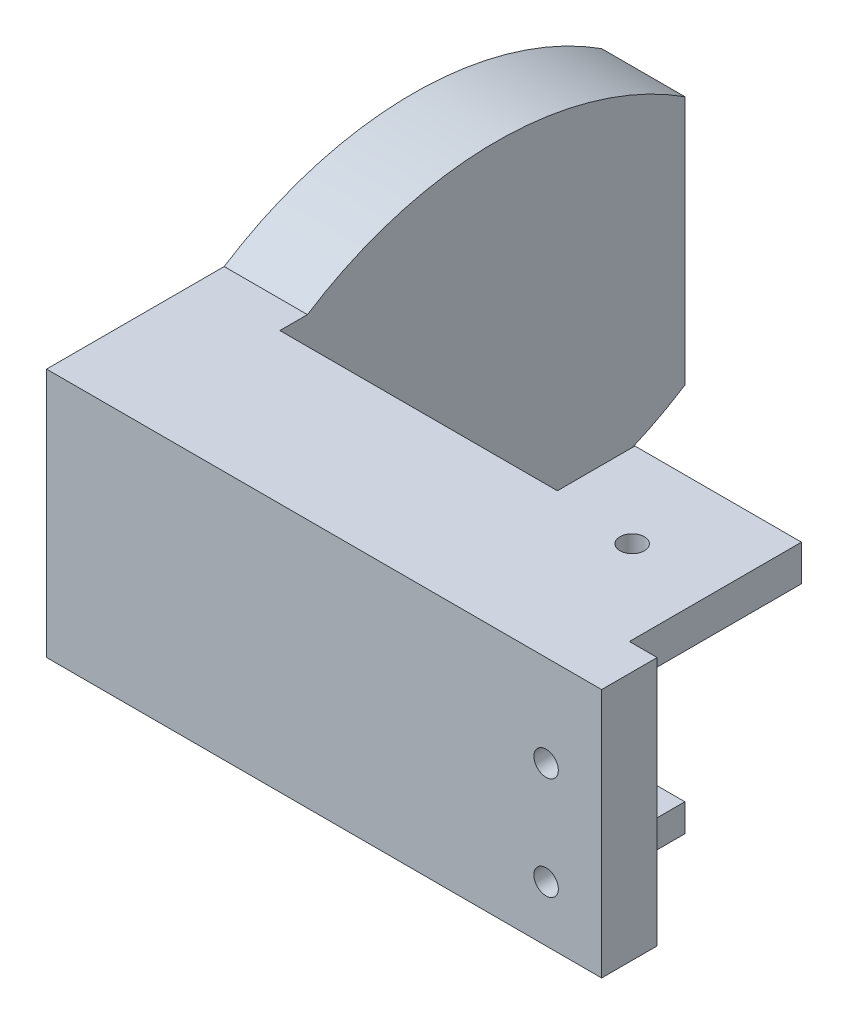
ISO-10303-21;
HEADER;
FILE_DESCRIPTION(('STEP AP214'),'2;1');
FILE_NAME('part.step','',(''),(''),'','','');
FILE_SCHEMA(('AUTOMOTIVE_DESIGN { 1 0 10303 214 1 1 1 1 }'));
ENDSEC;
DATA;
#1=APPLICATION_CONTEXT('core data for automotive mechanical design processes');
#2=APPLICATION_PROTOCOL_DEFINITION('international standard','automotive_design',2000,#1);
#3=PRODUCT_CONTEXT('',#1,'mechanical');
#4=PRODUCT('Part','Part','',(#3));
#5=PRODUCT_RELATED_PRODUCT_CATEGORY('part','',(#4));
#6=PRODUCT_DEFINITION_FORMATION('','',#4);
#7=PRODUCT_DEFINITION_CONTEXT('part definition',#1,'design');
#8=PRODUCT_DEFINITION('design','',#6,#7);
#9=PRODUCT_DEFINITION_SHAPE('','',#8);
#10=(LENGTH_UNIT() NAMED_UNIT(*) SI_UNIT(.MILLI.,.METRE.));
#11=(NAMED_UNIT(*) PLANE_ANGLE_UNIT() SI_UNIT($,.RADIAN.));
#12=(NAMED_UNIT(*) SI_UNIT($,.STERADIAN.) SOLID_ANGLE_UNIT());
#13=UNCERTAINTY_MEASURE_WITH_UNIT(LENGTH_MEASURE(1.E-05),#10,'distance_accuracy_value','');
#14=(GEOMETRIC_REPRESENTATION_CONTEXT(3) GLOBAL_UNCERTAINTY_ASSIGNED_CONTEXT((#13)) GLOBAL_UNIT_ASSIGNED_CONTEXT((#10,
#11,#12)) REPRESENTATION_CONTEXT('',''));
#15=CARTESIAN_POINT('',(0.,0.,0.));
#16=DIRECTION('',(0.,0.,1.));
#17=DIRECTION('',(1.,0.,0.));
#18=AXIS2_PLACEMENT_3D('',#15,#16,#17);
#19=CARTESIAN_POINT('',(-152.4,0.,0.));
#20=DIRECTION('',(1.,0.,0.));
#21=DIRECTION('',(0.,0.,1.));
#22=AXIS2_PLACEMENT_3D('',#19,#20,#21);
#23=PLANE('',#22);
#24=CARTESIAN_POINT('',(-152.4,25.4,0.));
#25=DIRECTION('',(-1.,0.,0.));
#26=DIRECTION('',(0.,0.,1.));
#27=AXIS2_PLACEMENT_3D('',#24,#25,#26);
#28=CIRCLE('',#27,28.575);
#29=CARTESIAN_POINT('',(-152.4,14.2875,26.325709273446));
#30=VERTEX_POINT('',#29);
#31=CARTESIAN_POINT('',(-152.4,35.5600000000367,26.7077708728986));
#32=VERTEX_POINT('',#31);
#33=EDGE_CURVE('E261',#30,#32,#28,.T.);
#34=ORIENTED_EDGE('',*,*,#33,.T.);
#35=DIRECTION('',(0.,0.,-1.));
#36=VECTOR('',#35,1.);
#37=CARTESIAN_POINT('',(-152.4,35.5600000000367,15.875));
#38=LINE('',#37,#36);
#39=CARTESIAN_POINT('',(-152.4,35.5600000000367,35.56));
#40=VERTEX_POINT('',#39);
#41=EDGE_CURVE('E231',#40,#32,#38,.T.);
#42=ORIENTED_EDGE('',*,*,#41,.F.);
#43=DIRECTION('',(0.,-1.,0.));
#44=VECTOR('',#43,1.);
#45=CARTESIAN_POINT('',(-152.4,39.6875,35.56));
#46=LINE('',#45,#44);
#47=CARTESIAN_POINT('',(-152.4,14.2875,35.56));
#48=VERTEX_POINT('',#47);
#49=EDGE_CURVE('E262',#40,#48,#46,.T.);
#50=ORIENTED_EDGE('',*,*,#49,.T.);
#51=DIRECTION('',(0.,0.,1.));
#52=VECTOR('',#51,1.);
#53=CARTESIAN_POINT('',(-152.4,14.2875,35.56));
#54=LINE('',#53,#52);
#55=EDGE_CURVE('E165',#30,#48,#54,.T.);
#56=ORIENTED_EDGE('',*,*,#55,.F.);
#57=EDGE_LOOP('',(#34,#42,#50,#56));
#58=FACE_BOUND('',#57,.T.);
#59=ADVANCED_FACE('F37',(#58),#23,.T.);
#60=CARTESIAN_POINT('',(-130.175,11.1125,35.56));
#61=DIRECTION('',(0.,0.,-1.));
#62=DIRECTION('',(1.,0.,0.));
#63=AXIS2_PLACEMENT_3D('',#60,#61,#62);
#64=PLANE('',#63);
#65=CARTESIAN_POINT('',(-136.525,17.4625,35.56));
#66=DIRECTION('',(0.,0.,1.));
#67=DIRECTION('',(1.,0.,0.));
#68=AXIS2_PLACEMENT_3D('',#65,#66,#67);
#69=CIRCLE('',#68,1.39699999999828);
#70=CARTESIAN_POINT('',(-135.128000000002,17.4625,35.56));
#71=VERTEX_POINT('',#70);
#72=EDGE_CURVE('E198',#71,#71,#69,.T.);
#73=ORIENTED_EDGE('',*,*,#72,.T.);
#74=EDGE_LOOP('',(#73));
#75=FACE_BOUND('',#74,.T.);
#76=CARTESIAN_POINT('',(-136.525,29.2100000000367,35.56));
#77=DIRECTION('',(0.,0.,1.));
#78=DIRECTION('',(1.,0.,0.));
#79=AXIS2_PLACEMENT_3D('',#76,#77,#78);
#80=CIRCLE('',#79,1.39699999999828);
#81=CARTESIAN_POINT('',(-135.128000000002,29.2100000000367,35.56));
#82=VERTEX_POINT('',#81);
#83=EDGE_CURVE('E193',#82,#82,#80,.T.);
#84=ORIENTED_EDGE('',*,*,#83,.T.);
#85=EDGE_LOOP('',(#84));
#86=FACE_BOUND('',#85,.T.);
#87=ORIENTED_EDGE('',*,*,#49,.F.);
#88=DIRECTION('',(-1.,0.,0.));
#89=VECTOR('',#88,1.);
#90=CARTESIAN_POINT('',(-133.35,35.5600000000367,35.56));
#91=LINE('',#90,#89);
#92=CARTESIAN_POINT('',(-133.35,35.5600000000367,35.56));
#93=VERTEX_POINT('',#92);
#94=EDGE_CURVE('E235',#93,#40,#91,.T.);
#95=ORIENTED_EDGE('',*,*,#94,.F.);
#96=DIRECTION('',(0.,-1.,0.));
#97=VECTOR('',#96,1.);
#98=CARTESIAN_POINT('',(-133.35,67.0809613548562,35.56));
#99=LINE('',#98,#97);
#100=CARTESIAN_POINT('',(-133.35,39.6875,35.56));
#101=VERTEX_POINT('',#100);
#102=EDGE_CURVE('E238',#101,#93,#99,.T.);
#103=ORIENTED_EDGE('',*,*,#102,.F.);
#104=DIRECTION('',(-1.,0.,0.));
#105=VECTOR('',#104,1.);
#106=CARTESIAN_POINT('',(-130.175,39.6875,35.56));
#107=LINE('',#106,#105);
#108=CARTESIAN_POINT('',(-130.175,39.6875,35.56));
#109=VERTEX_POINT('',#108);
#110=EDGE_CURVE('E212',#109,#101,#107,.T.);
#111=ORIENTED_EDGE('',*,*,#110,.F.);
#112=DIRECTION('',(0.,1.,0.));
#113=VECTOR('',#112,1.);
#114=CARTESIAN_POINT('',(-130.175,11.1125,35.56));
#115=LINE('',#114,#113);
#116=CARTESIAN_POINT('',(-130.175,11.1125,35.56));
#117=VERTEX_POINT('',#116);
#118=EDGE_CURVE('E202',#117,#109,#115,.T.);
#119=ORIENTED_EDGE('',*,*,#118,.F.);
#120=DIRECTION('',(-1.,0.,0.));
#121=VECTOR('',#120,1.);
#122=CARTESIAN_POINT('',(-130.175,11.1125,35.56));
#123=LINE('',#122,#121);
#124=CARTESIAN_POINT('',(-139.7,11.1125,35.56));
#125=VERTEX_POINT('',#124);
#126=EDGE_CURVE('E214',#117,#125,#123,.T.);
#127=ORIENTED_EDGE('',*,*,#126,.T.);
#128=DIRECTION('',(0.,1.,0.));
#129=VECTOR('',#128,1.);
#130=CARTESIAN_POINT('',(-139.7,-6.84801224213828,35.56));
#131=LINE('',#130,#129);
#132=CARTESIAN_POINT('',(-139.7,14.2875,35.56));
#133=VERTEX_POINT('',#132);
#134=EDGE_CURVE('E352',#125,#133,#131,.T.);
#135=ORIENTED_EDGE('',*,*,#134,.T.);
#136=DIRECTION('',(1.,0.,0.));
#137=VECTOR('',#136,1.);
#138=CARTESIAN_POINT('',(-139.7,14.2875,35.56));
#139=LINE('',#138,#137);
#140=EDGE_CURVE('E189',#48,#133,#139,.T.);
#141=ORIENTED_EDGE('',*,*,#140,.F.);
#142=EDGE_LOOP('',(#87,#95,#103,#111,#119,#127,#135,#141));
#143=FACE_BOUND('',#142,.T.);
#144=ADVANCED_FACE('F331',(#75,#86,#143),#64,.T.);
#145=CARTESIAN_POINT('',(-193.675,6.15950000000119,-3.10155059200292E-13));
#146=DIRECTION('',(1.,0.,0.));
#147=DIRECTION('',(0.,0.,1.));
#148=AXIS2_PLACEMENT_3D('',#145,#146,#147);
#149=CYLINDRICAL_SURFACE('',#148,39.8779999999988);
#150=CARTESIAN_POINT('',(-184.15,6.15950000000119,-3.10155059200292E-13));
#151=DIRECTION('',(1.,0.,0.));
#152=DIRECTION('',(0.,0.,1.));
#153=AXIS2_PLACEMENT_3D('',#150,#151,#152);
#154=CIRCLE('',#153,39.8779999999988);
#155=CARTESIAN_POINT('',(-184.15,39.6875,-21.59));
#156=VERTEX_POINT('',#155);
#157=CARTESIAN_POINT('',(-184.15,39.6875,21.5899999999993));
#158=VERTEX_POINT('',#157);
#159=EDGE_CURVE('E268',#156,#158,#154,.T.);
#160=ORIENTED_EDGE('',*,*,#159,.F.);
#161=DIRECTION('',(1.,0.,0.));
#162=VECTOR('',#161,1.);
#163=CARTESIAN_POINT('',(-193.675,39.6875,-21.59));
#164=LINE('',#163,#162);
#165=CARTESIAN_POINT('',(-193.675,39.6875,-21.59));
#166=VERTEX_POINT('',#165);
#167=EDGE_CURVE('E284',#166,#156,#164,.T.);
#168=ORIENTED_EDGE('',*,*,#167,.F.);
#169=CARTESIAN_POINT('',(-193.675,6.15950000000119,-3.10155059200292E-13));
#170=DIRECTION('',(1.,0.,0.));
#171=DIRECTION('',(0.,0.,1.));
#172=AXIS2_PLACEMENT_3D('',#169,#170,#171);
#173=CIRCLE('',#172,39.8779999999988);
#174=CARTESIAN_POINT('',(-193.675,39.6875,21.5899999999993));
#175=VERTEX_POINT('',#174);
#176=EDGE_CURVE('E269',#166,#175,#173,.T.);
#177=ORIENTED_EDGE('',*,*,#176,.T.);
#178=DIRECTION('',(1.,0.,0.));
#179=VECTOR('',#178,1.);
#180=CARTESIAN_POINT('',(-193.675,39.6875,21.5899999999993));
#181=LINE('',#180,#179);
#182=EDGE_CURVE('E45',#175,#158,#181,.T.);
#183=ORIENTED_EDGE('',*,*,#182,.T.);
#184=EDGE_LOOP('',(#160,#168,#177,#183));
#185=FACE_BOUND('',#184,.T.);
#186=ADVANCED_FACE('F39',(#185),#149,.T.);
#187=CARTESIAN_POINT('',(-193.675,39.6875,35.56));
#188=DIRECTION('',(0.,-1.,0.));
#189=DIRECTION('',(0.,0.,-1.));
#190=AXIS2_PLACEMENT_3D('',#187,#188,#189);
#191=PLANE('',#190);
#192=DIRECTION('',(0.,0.,1.));
#193=VECTOR('',#192,1.);
#194=CARTESIAN_POINT('',(-184.15,39.6875,35.56));
#195=LINE('',#194,#193);
#196=CARTESIAN_POINT('',(-184.15,39.6875,24.7466759131403));
#197=VERTEX_POINT('',#196);
#198=EDGE_CURVE('E287',#158,#197,#195,.T.);
#199=ORIENTED_EDGE('',*,*,#198,.F.);
#200=ORIENTED_EDGE('',*,*,#182,.F.);
#201=DIRECTION('',(0.,0.,1.));
#202=VECTOR('',#201,1.);
#203=CARTESIAN_POINT('',(-193.675,39.6875,35.56));
#204=LINE('',#203,#202);
#205=CARTESIAN_POINT('',(-193.675,39.6875,41.91));
#206=VERTEX_POINT('',#205);
#207=EDGE_CURVE('E272',#175,#206,#204,.T.);
#208=ORIENTED_EDGE('',*,*,#207,.T.);
#209=DIRECTION('',(-1.,0.,0.));
#210=VECTOR('',#209,1.);
#211=CARTESIAN_POINT('',(-130.175,39.6875,41.91));
#212=LINE('',#211,#210);
#213=CARTESIAN_POINT('',(-130.175,39.6875,41.91));
#214=VERTEX_POINT('',#213);
#215=EDGE_CURVE('E221',#214,#206,#212,.T.);
#216=ORIENTED_EDGE('',*,*,#215,.F.);
#217=DIRECTION('',(0.,0.,1.));
#218=VECTOR('',#217,1.);
#219=CARTESIAN_POINT('',(-130.175,39.6875,35.56));
#220=LINE('',#219,#218);
#221=EDGE_CURVE('E205',#109,#214,#220,.T.);
#222=ORIENTED_EDGE('',*,*,#221,.F.);
#223=ORIENTED_EDGE('',*,*,#110,.T.);
#224=DIRECTION('',(0.,0.,-1.));
#225=VECTOR('',#224,1.);
#226=CARTESIAN_POINT('',(-133.35,39.6875,15.875));
#227=LINE('',#226,#225);
#228=CARTESIAN_POINT('',(-133.35,39.6875,15.875));
#229=VERTEX_POINT('',#228);
#230=EDGE_CURVE('E244',#101,#229,#227,.T.);
#231=ORIENTED_EDGE('',*,*,#230,.T.);
#232=DIRECTION('',(-1.,0.,0.));
#233=VECTOR('',#232,1.);
#234=CARTESIAN_POINT('',(-133.35,39.6875,15.875));
#235=LINE('',#234,#233);
#236=CARTESIAN_POINT('',(-152.4,39.6875,15.875));
#237=VERTEX_POINT('',#236);
#238=EDGE_CURVE('E234',#229,#237,#235,.T.);
#239=ORIENTED_EDGE('',*,*,#238,.T.);
#240=DIRECTION('',(0.,0.,1.));
#241=VECTOR('',#240,1.);
#242=CARTESIAN_POINT('',(-152.4,39.6875,15.875));
#243=LINE('',#242,#241);
#244=CARTESIAN_POINT('',(-152.4,39.6875,24.7466759131403));
#245=VERTEX_POINT('',#244);
#246=EDGE_CURVE('E237',#237,#245,#243,.T.);
#247=ORIENTED_EDGE('',*,*,#246,.T.);
#248=DIRECTION('',(-1.,0.,0.));
#249=VECTOR('',#248,1.);
#250=CARTESIAN_POINT('',(-121.847445232723,39.6875,24.7466759131403));
#251=LINE('',#250,#249);
#252=EDGE_CURVE('E260',#245,#197,#251,.T.);
#253=ORIENTED_EDGE('',*,*,#252,.T.);
#254=EDGE_LOOP('',(#199,#200,#208,#216,#222,#223,#231,#239,#247,#253));
#255=FACE_BOUND('',#254,.T.);
#256=CARTESIAN_POINT('',(-142.875,39.6875,25.7175));
#257=DIRECTION('',(0.,1.,0.));
#258=DIRECTION('',(0.,0.,-1.));
#259=AXIS2_PLACEMENT_3D('',#256,#257,#258);
#260=CIRCLE('',#259,1.39700000000002);
#261=CARTESIAN_POINT('',(-142.875,39.6875,24.3205));
#262=VERTEX_POINT('',#261);
#263=EDGE_CURVE('E229',#262,#262,#260,.T.);
#264=ORIENTED_EDGE('',*,*,#263,.F.);
#265=EDGE_LOOP('',(#264));
#266=FACE_BOUND('',#265,.T.);
#267=ADVANCED_FACE('F317',(#255,#266),#191,.F.);
#268=CARTESIAN_POINT('',(-193.675,11.1125,21.5899999999993));
#269=DIRECTION('',(0.,1.,0.));
#270=DIRECTION('',(0.,0.,1.));
#271=AXIS2_PLACEMENT_3D('',#268,#269,#270);
#272=PLANE('',#271);
#273=DIRECTION('',(0.,0.,-1.));
#274=VECTOR('',#273,1.);
#275=CARTESIAN_POINT('',(-152.4,11.1125,35.56));
#276=LINE('',#275,#274);
#277=CARTESIAN_POINT('',(-152.4,11.1125,24.7466759131403));
#278=VERTEX_POINT('',#277);
#279=CARTESIAN_POINT('',(-152.4,11.1125,22.86));
#280=VERTEX_POINT('',#279);
#281=EDGE_CURVE('E160',#278,#280,#276,.T.);
#282=ORIENTED_EDGE('',*,*,#281,.T.);
#283=DIRECTION('',(1.,0.,0.));
#284=VECTOR('',#283,1.);
#285=CARTESIAN_POINT('',(-139.7,11.1125,22.86));
#286=LINE('',#285,#284);
#287=CARTESIAN_POINT('',(-139.7,11.1125,22.86));
#288=VERTEX_POINT('',#287);
#289=EDGE_CURVE('E168',#280,#288,#286,.T.);
#290=ORIENTED_EDGE('',*,*,#289,.T.);
#291=DIRECTION('',(0.,0.,1.));
#292=VECTOR('',#291,1.);
#293=CARTESIAN_POINT('',(-139.7,11.1125,35.56));
#294=LINE('',#293,#292);
#295=EDGE_CURVE('E349',#288,#125,#294,.T.);
#296=ORIENTED_EDGE('',*,*,#295,.T.);
#297=ORIENTED_EDGE('',*,*,#126,.F.);
#298=DIRECTION('',(0.,0.,-1.));
#299=VECTOR('',#298,1.);
#300=CARTESIAN_POINT('',(-130.175,11.1125,35.56));
#301=LINE('',#300,#299);
#302=CARTESIAN_POINT('',(-130.175,11.1125,41.91));
#303=VERTEX_POINT('',#302);
#304=EDGE_CURVE('E210',#303,#117,#301,.T.);
#305=ORIENTED_EDGE('',*,*,#304,.F.);
#306=DIRECTION('',(-1.,0.,0.));
#307=VECTOR('',#306,1.);
#308=CARTESIAN_POINT('',(-130.175,11.1125,41.91));
#309=LINE('',#308,#307);
#310=CARTESIAN_POINT('',(-193.675,11.1125,41.91));
#311=VERTEX_POINT('',#310);
#312=EDGE_CURVE('E218',#303,#311,#309,.T.);
#313=ORIENTED_EDGE('',*,*,#312,.T.);
#314=DIRECTION('',(0.,0.,-1.));
#315=VECTOR('',#314,1.);
#316=CARTESIAN_POINT('',(-193.675,11.1125,21.5899999999993));
#317=LINE('',#316,#315);
#318=CARTESIAN_POINT('',(-193.675,11.1125,21.5899999999993));
#319=VERTEX_POINT('',#318);
#320=EDGE_CURVE('E276',#311,#319,#317,.T.);
#321=ORIENTED_EDGE('',*,*,#320,.T.);
#322=DIRECTION('',(1.,0.,0.));
#323=VECTOR('',#322,1.);
#324=CARTESIAN_POINT('',(-193.675,11.1125,21.5899999999993));
#325=LINE('',#324,#323);
#326=CARTESIAN_POINT('',(-184.15,11.1125,21.5899999999993));
#327=VERTEX_POINT('',#326);
#328=EDGE_CURVE('E300',#319,#327,#325,.T.);
#329=ORIENTED_EDGE('',*,*,#328,.T.);
#330=DIRECTION('',(0.,0.,-1.));
#331=VECTOR('',#330,1.);
#332=CARTESIAN_POINT('',(-184.15,11.1125,21.5899999999993));
#333=LINE('',#332,#331);
#334=CARTESIAN_POINT('',(-184.15,11.1125,24.7466759131403));
#335=VERTEX_POINT('',#334);
#336=EDGE_CURVE('E289',#335,#327,#333,.T.);
#337=ORIENTED_EDGE('',*,*,#336,.F.);
#338=DIRECTION('',(-1.,0.,0.));
#339=VECTOR('',#338,1.);
#340=CARTESIAN_POINT('',(-121.847445232723,11.1125,24.7466759131403));
#341=LINE('',#340,#339);
#342=EDGE_CURVE('E179',#278,#335,#341,.T.);
#343=ORIENTED_EDGE('',*,*,#342,.F.);
#344=EDGE_LOOP('',(#282,#290,#296,#297,#305,#313,#321,#329,#337,#343));
#345=FACE_BOUND('',#344,.T.);
#346=CARTESIAN_POINT('',(-146.05,11.1125,29.21));
#347=DIRECTION('',(0.,-1.,0.));
#348=DIRECTION('',(0.,0.,1.));
#349=AXIS2_PLACEMENT_3D('',#346,#347,#348);
#350=CIRCLE('',#349,1.39700000000002);
#351=CARTESIAN_POINT('',(-146.05,11.1125,30.607));
#352=VERTEX_POINT('',#351);
#353=EDGE_CURVE('E185',#352,#352,#350,.T.);
#354=ORIENTED_EDGE('',*,*,#353,.F.);
#355=EDGE_LOOP('',(#354));
#356=FACE_BOUND('',#355,.T.);
#357=ADVANCED_FACE('F176',(#345,#356),#272,.F.);
#358=CARTESIAN_POINT('',(-193.675,44.6404999999988,-3.52148865623292E-13));
#359=DIRECTION('',(1.,0.,0.));
#360=DIRECTION('',(0.,0.,1.));
#361=AXIS2_PLACEMENT_3D('',#358,#359,#360);
#362=CYLINDRICAL_SURFACE('',#361,39.8779999999988);
#363=CARTESIAN_POINT('',(-184.15,44.6404999999988,-3.52148865623292E-13));
#364=DIRECTION('',(1.,0.,0.));
#365=DIRECTION('',(0.,0.,-1.));
#366=AXIS2_PLACEMENT_3D('',#363,#364,#365);
#367=CIRCLE('',#366,39.8779999999988);
#368=CARTESIAN_POINT('',(-184.15,11.1125,-21.59));
#369=VERTEX_POINT('',#368);
#370=EDGE_CURVE('E291',#327,#369,#367,.T.);
#371=ORIENTED_EDGE('',*,*,#370,.F.);
#372=ORIENTED_EDGE('',*,*,#328,.F.);
#373=CARTESIAN_POINT('',(-193.675,44.6404999999988,-3.52148865623292E-13));
#374=DIRECTION('',(1.,0.,0.));
#375=DIRECTION('',(0.,0.,-1.));
#376=AXIS2_PLACEMENT_3D('',#373,#374,#375);
#377=CIRCLE('',#376,39.8779999999988);
#378=CARTESIAN_POINT('',(-193.675,11.1125,-21.59));
#379=VERTEX_POINT('',#378);
#380=EDGE_CURVE('E279',#319,#379,#377,.T.);
#381=ORIENTED_EDGE('',*,*,#380,.T.);
#382=DIRECTION('',(1.,0.,0.));
#383=VECTOR('',#382,1.);
#384=CARTESIAN_POINT('',(-193.675,11.1125,-21.59));
#385=LINE('',#384,#383);
#386=EDGE_CURVE('E297',#379,#369,#385,.T.);
#387=ORIENTED_EDGE('',*,*,#386,.T.);
#388=EDGE_LOOP('',(#371,#372,#381,#387));
#389=FACE_BOUND('',#388,.T.);
#390=ADVANCED_FACE('F348',(#389),#362,.T.);
#391=CARTESIAN_POINT('',(-193.675,39.6875,-21.59));
#392=DIRECTION('',(0.,0.,1.));
#393=DIRECTION('',(0.,-1.,0.));
#394=AXIS2_PLACEMENT_3D('',#391,#392,#393);
#395=PLANE('',#394);
#396=DIRECTION('',(0.,1.,0.));
#397=VECTOR('',#396,1.);
#398=CARTESIAN_POINT('',(-184.15,39.6875,-21.59));
#399=LINE('',#398,#397);
#400=EDGE_CURVE('E273',#369,#156,#399,.T.);
#401=ORIENTED_EDGE('',*,*,#400,.F.);
#402=ORIENTED_EDGE('',*,*,#386,.F.);
#403=DIRECTION('',(0.,1.,0.));
#404=VECTOR('',#403,1.);
#405=CARTESIAN_POINT('',(-193.675,39.6875,-21.59));
#406=LINE('',#405,#404);
#407=EDGE_CURVE('E282',#379,#166,#406,.T.);
#408=ORIENTED_EDGE('',*,*,#407,.T.);
#409=ORIENTED_EDGE('',*,*,#167,.T.);
#410=EDGE_LOOP('',(#401,#402,#408,#409));
#411=FACE_BOUND('',#410,.T.);
#412=ADVANCED_FACE('F312',(#411),#395,.F.);
#413=CARTESIAN_POINT('',(-193.675,6.15950000000119,-3.10155059200292E-13));
#414=DIRECTION('',(1.,0.,0.));
#415=DIRECTION('',(0.,0.,1.));
#416=AXIS2_PLACEMENT_3D('',#413,#414,#415);
#417=PLANE('',#416);
#418=ORIENTED_EDGE('',*,*,#207,.F.);
#419=ORIENTED_EDGE('',*,*,#176,.F.);
#420=ORIENTED_EDGE('',*,*,#407,.F.);
#421=ORIENTED_EDGE('',*,*,#380,.F.);
#422=ORIENTED_EDGE('',*,*,#320,.F.);
#423=DIRECTION('',(0.,-1.,0.));
#424=VECTOR('',#423,1.);
#425=CARTESIAN_POINT('',(-193.675,11.1125,41.91));
#426=LINE('',#425,#424);
#427=EDGE_CURVE('E201',#206,#311,#426,.T.);
#428=ORIENTED_EDGE('',*,*,#427,.F.);
#429=EDGE_LOOP('',(#418,#419,#420,#421,#422,#428));
#430=FACE_BOUND('',#429,.T.);
#431=ADVANCED_FACE('F314',(#430),#417,.F.);
#432=CARTESIAN_POINT('',(-184.15,6.15950000000119,-3.10155059200292E-13));
#433=DIRECTION('',(1.,0.,0.));
#434=DIRECTION('',(0.,0.,1.));
#435=AXIS2_PLACEMENT_3D('',#432,#433,#434);
#436=PLANE('',#435);
#437=CARTESIAN_POINT('',(-184.15,25.4,0.));
#438=DIRECTION('',(-1.,0.,0.));
#439=DIRECTION('',(0.,0.,1.));
#440=AXIS2_PLACEMENT_3D('',#437,#438,#439);
#441=CIRCLE('',#440,28.575);
#442=EDGE_CURVE('E11',#197,#335,#441,.F.);
#443=ORIENTED_EDGE('',*,*,#442,.T.);
#444=ORIENTED_EDGE('',*,*,#336,.T.);
#445=ORIENTED_EDGE('',*,*,#370,.T.);
#446=ORIENTED_EDGE('',*,*,#400,.T.);
#447=ORIENTED_EDGE('',*,*,#159,.T.);
#448=ORIENTED_EDGE('',*,*,#198,.T.);
#449=EDGE_LOOP('',(#443,#444,#445,#446,#447,#448));
#450=FACE_BOUND('',#449,.T.);
#451=ADVANCED_FACE('F309',(#450),#436,.T.);
#452=CARTESIAN_POINT('',(-121.847445232723,25.4,0.));
#453=DIRECTION('',(-1.,0.,0.));
#454=DIRECTION('',(0.,0.,-1.));
#455=AXIS2_PLACEMENT_3D('',#452,#453,#454);
#456=CYLINDRICAL_SURFACE('',#455,28.575);
#457=ORIENTED_EDGE('',*,*,#252,.F.);
#458=EDGE_CURVE('E257',#32,#245,#28,.T.);
#459=ORIENTED_EDGE('',*,*,#458,.F.);
#460=ORIENTED_EDGE('',*,*,#33,.F.);
#461=EDGE_CURVE('E258',#278,#30,#28,.T.);
#462=ORIENTED_EDGE('',*,*,#461,.F.);
#463=ORIENTED_EDGE('',*,*,#342,.T.);
#464=ORIENTED_EDGE('',*,*,#442,.F.);
#465=EDGE_LOOP('',(#457,#459,#460,#462,#463,#464));
#466=FACE_BOUND('',#465,.T.);
#467=ADVANCED_FACE('F344',(#466),#456,.F.);
#468=CARTESIAN_POINT('',(0.,35.5600000000367,0.));
#469=DIRECTION('',(0.,1.,0.));
#470=DIRECTION('',(0.,0.,1.));
#471=AXIS2_PLACEMENT_3D('',#468,#469,#470);
#472=PLANE('',#471);
#473=DIRECTION('',(0.,0.,1.));
#474=VECTOR('',#473,1.);
#475=CARTESIAN_POINT('',(-133.35,35.5600000000367,15.875));
#476=LINE('',#475,#474);
#477=CARTESIAN_POINT('',(-133.35,35.5600000000367,15.875));
#478=VERTEX_POINT('',#477);
#479=EDGE_CURVE('E239',#478,#93,#476,.T.);
#480=ORIENTED_EDGE('',*,*,#479,.T.);
#481=ORIENTED_EDGE('',*,*,#94,.T.);
#482=ORIENTED_EDGE('',*,*,#41,.T.);
#483=CARTESIAN_POINT('',(-152.4,35.5600000000367,15.875));
#484=VERTEX_POINT('',#483);
#485=EDGE_CURVE('E52',#32,#484,#38,.T.);
#486=ORIENTED_EDGE('',*,*,#485,.T.);
#487=DIRECTION('',(1.,0.,0.));
#488=VECTOR('',#487,1.);
#489=CARTESIAN_POINT('',(-133.35,35.5600000000367,15.875));
#490=LINE('',#489,#488);
#491=EDGE_CURVE('E226',#484,#478,#490,.T.);
#492=ORIENTED_EDGE('',*,*,#491,.T.);
#493=EDGE_LOOP('',(#480,#481,#482,#486,#492));
#494=FACE_BOUND('',#493,.T.);
#495=CARTESIAN_POINT('',(-142.875,35.5600000000367,25.7175));
#496=DIRECTION('',(0.,-1.,0.));
#497=DIRECTION('',(0.,0.,1.));
#498=AXIS2_PLACEMENT_3D('',#495,#496,#497);
#499=CIRCLE('',#498,1.39700000000002);
#500=CARTESIAN_POINT('',(-142.875,35.5600000000367,27.1145));
#501=VERTEX_POINT('',#500);
#502=EDGE_CURVE('E217',#501,#501,#499,.T.);
#503=ORIENTED_EDGE('',*,*,#502,.F.);
#504=EDGE_LOOP('',(#503));
#505=FACE_BOUND('',#504,.T.);
#506=ADVANCED_FACE('F373',(#494,#505),#472,.F.);
#507=CARTESIAN_POINT('',(-133.35,67.0809613548562,15.875));
#508=DIRECTION('',(-1.,0.,0.));
#509=DIRECTION('',(0.,0.,-1.));
#510=AXIS2_PLACEMENT_3D('',#507,#508,#509);
#511=PLANE('',#510);
#512=ORIENTED_EDGE('',*,*,#102,.T.);
#513=ORIENTED_EDGE('',*,*,#479,.F.);
#514=DIRECTION('',(0.,-1.,0.));
#515=VECTOR('',#514,1.);
#516=CARTESIAN_POINT('',(-133.35,67.0809613548562,15.875));
#517=LINE('',#516,#515);
#518=EDGE_CURVE('E241',#229,#478,#517,.T.);
#519=ORIENTED_EDGE('',*,*,#518,.F.);
#520=ORIENTED_EDGE('',*,*,#230,.F.);
#521=EDGE_LOOP('',(#512,#513,#519,#520));
#522=FACE_BOUND('',#521,.T.);
#523=ADVANCED_FACE('F335',(#522),#511,.F.);
#524=CARTESIAN_POINT('',(-152.4,67.0809613548562,15.875));
#525=DIRECTION('',(1.,0.,0.));
#526=DIRECTION('',(0.,0.,1.));
#527=AXIS2_PLACEMENT_3D('',#524,#525,#526);
#528=PLANE('',#527);
#529=ORIENTED_EDGE('',*,*,#458,.T.);
#530=ORIENTED_EDGE('',*,*,#246,.F.);
#531=DIRECTION('',(0.,-1.,0.));
#532=VECTOR('',#531,1.);
#533=CARTESIAN_POINT('',(-152.4,67.0809613548562,15.875));
#534=LINE('',#533,#532);
#535=EDGE_CURVE('E230',#237,#484,#534,.T.);
#536=ORIENTED_EDGE('',*,*,#535,.T.);
#537=ORIENTED_EDGE('',*,*,#485,.F.);
#538=EDGE_LOOP('',(#529,#530,#536,#537));
#539=FACE_BOUND('',#538,.T.);
#540=ADVANCED_FACE('F341',(#539),#528,.F.);
#541=CARTESIAN_POINT('',(-133.35,67.0809613548562,15.875));
#542=DIRECTION('',(0.,0.,1.));
#543=DIRECTION('',(-1.,0.,0.));
#544=AXIS2_PLACEMENT_3D('',#541,#542,#543);
#545=PLANE('',#544);
#546=ORIENTED_EDGE('',*,*,#518,.T.);
#547=ORIENTED_EDGE('',*,*,#491,.F.);
#548=ORIENTED_EDGE('',*,*,#535,.F.);
#549=ORIENTED_EDGE('',*,*,#238,.F.);
#550=EDGE_LOOP('',(#546,#547,#548,#549));
#551=FACE_BOUND('',#550,.T.);
#552=ADVANCED_FACE('F339',(#551),#545,.F.);
#553=CARTESIAN_POINT('',(-142.875,67.0809613548562,25.7175));
#554=DIRECTION('',(0.,-1.,0.));
#555=DIRECTION('',(0.,0.,-1.));
#556=AXIS2_PLACEMENT_3D('',#553,#554,#555);
#557=CYLINDRICAL_SURFACE('',#556,1.39700000000002);
#558=ORIENTED_EDGE('',*,*,#263,.T.);
#559=EDGE_LOOP('',(#558));
#560=FACE_BOUND('',#559,.T.);
#561=ORIENTED_EDGE('',*,*,#502,.T.);
#562=EDGE_LOOP('',(#561));
#563=FACE_BOUND('',#562,.T.);
#564=ADVANCED_FACE('F379',(#560,#563),#557,.F.);
#565=CARTESIAN_POINT('',(-130.175,11.1125,41.91));
#566=DIRECTION('',(0.,0.,1.));
#567=DIRECTION('',(-1.,0.,0.));
#568=AXIS2_PLACEMENT_3D('',#565,#566,#567);
#569=PLANE('',#568);
#570=CARTESIAN_POINT('',(-136.525,17.4625,41.91));
#571=DIRECTION('',(0.,0.,-1.));
#572=DIRECTION('',(-1.,0.,0.));
#573=AXIS2_PLACEMENT_3D('',#570,#571,#572);
#574=CIRCLE('',#573,1.39699999999828);
#575=CARTESIAN_POINT('',(-137.921999999998,17.4625,41.91));
#576=VERTEX_POINT('',#575);
#577=EDGE_CURVE('E190',#576,#576,#574,.T.);
#578=ORIENTED_EDGE('',*,*,#577,.T.);
#579=EDGE_LOOP('',(#578));
#580=FACE_BOUND('',#579,.T.);
#581=CARTESIAN_POINT('',(-136.525,29.2100000000367,41.91));
#582=DIRECTION('',(0.,0.,-1.));
#583=DIRECTION('',(-1.,0.,0.));
#584=AXIS2_PLACEMENT_3D('',#581,#582,#583);
#585=CIRCLE('',#584,1.39699999999828);
#586=CARTESIAN_POINT('',(-137.921999999998,29.2100000000367,41.91));
#587=VERTEX_POINT('',#586);
#588=EDGE_CURVE('E188',#587,#587,#585,.T.);
#589=ORIENTED_EDGE('',*,*,#588,.T.);
#590=EDGE_LOOP('',(#589));
#591=FACE_BOUND('',#590,.T.);
#592=ORIENTED_EDGE('',*,*,#427,.T.);
#593=ORIENTED_EDGE('',*,*,#312,.F.);
#594=DIRECTION('',(0.,-1.,0.));
#595=VECTOR('',#594,1.);
#596=CARTESIAN_POINT('',(-130.175,11.1125,41.91));
#597=LINE('',#596,#595);
#598=EDGE_CURVE('E208',#214,#303,#597,.T.);
#599=ORIENTED_EDGE('',*,*,#598,.F.);
#600=ORIENTED_EDGE('',*,*,#215,.T.);
#601=EDGE_LOOP('',(#592,#593,#599,#600));
#602=FACE_BOUND('',#601,.T.);
#603=ADVANCED_FACE('F320',(#580,#591,#602),#569,.T.);
#604=CARTESIAN_POINT('',(-130.175,0.,0.));
#605=DIRECTION('',(-1.,0.,0.));
#606=DIRECTION('',(0.,0.,-1.));
#607=AXIS2_PLACEMENT_3D('',#604,#605,#606);
#608=PLANE('',#607);
#609=ORIENTED_EDGE('',*,*,#118,.T.);
#610=ORIENTED_EDGE('',*,*,#221,.T.);
#611=ORIENTED_EDGE('',*,*,#598,.T.);
#612=ORIENTED_EDGE('',*,*,#304,.T.);
#613=EDGE_LOOP('',(#609,#610,#611,#612));
#614=FACE_BOUND('',#613,.T.);
#615=ADVANCED_FACE('F324',(#614),#608,.F.);
#616=CARTESIAN_POINT('',(-136.525,29.2100000000367,16.51));
#617=DIRECTION('',(0.,0.,1.));
#618=DIRECTION('',(-1.,0.,0.));
#619=AXIS2_PLACEMENT_3D('',#616,#617,#618);
#620=CYLINDRICAL_SURFACE('',#619,1.39699999999828);
#621=ORIENTED_EDGE('',*,*,#83,.F.);
#622=EDGE_LOOP('',(#621));
#623=FACE_BOUND('',#622,.T.);
#624=ORIENTED_EDGE('',*,*,#588,.F.);
#625=EDGE_LOOP('',(#624));
#626=FACE_BOUND('',#625,.T.);
#627=ADVANCED_FACE('F542',(#623,#626),#620,.F.);
#628=CARTESIAN_POINT('',(-136.525,17.4625,16.51));
#629=DIRECTION('',(0.,0.,1.));
#630=DIRECTION('',(-1.,0.,0.));
#631=AXIS2_PLACEMENT_3D('',#628,#629,#630);
#632=CYLINDRICAL_SURFACE('',#631,1.39699999999828);
#633=ORIENTED_EDGE('',*,*,#72,.F.);
#634=EDGE_LOOP('',(#633));
#635=FACE_BOUND('',#634,.T.);
#636=ORIENTED_EDGE('',*,*,#577,.F.);
#637=EDGE_LOOP('',(#636));
#638=FACE_BOUND('',#637,.T.);
#639=ADVANCED_FACE('F494',(#635,#638),#632,.F.);
#640=CARTESIAN_POINT('',(0.,14.2875,0.));
#641=DIRECTION('',(0.,-1.,0.));
#642=DIRECTION('',(0.,0.,-1.));
#643=AXIS2_PLACEMENT_3D('',#640,#641,#642);
#644=PLANE('',#643);
#645=DIRECTION('',(0.,0.,-1.));
#646=VECTOR('',#645,1.);
#647=CARTESIAN_POINT('',(-139.7,14.2875,35.56));
#648=LINE('',#647,#646);
#649=CARTESIAN_POINT('',(-139.7,14.2875,22.86));
#650=VERTEX_POINT('',#649);
#651=EDGE_CURVE('E173',#133,#650,#648,.T.);
#652=ORIENTED_EDGE('',*,*,#651,.T.);
#653=DIRECTION('',(-1.,0.,0.));
#654=VECTOR('',#653,1.);
#655=CARTESIAN_POINT('',(-139.7,14.2875,22.86));
#656=LINE('',#655,#654);
#657=CARTESIAN_POINT('',(-152.4,14.2875,22.86));
#658=VERTEX_POINT('',#657);
#659=EDGE_CURVE('E180',#650,#658,#656,.T.);
#660=ORIENTED_EDGE('',*,*,#659,.T.);
#661=EDGE_CURVE('E161',#658,#30,#54,.T.);
#662=ORIENTED_EDGE('',*,*,#661,.T.);
#663=ORIENTED_EDGE('',*,*,#55,.T.);
#664=ORIENTED_EDGE('',*,*,#140,.T.);
#665=EDGE_LOOP('',(#652,#660,#662,#663,#664));
#666=FACE_BOUND('',#665,.T.);
#667=CARTESIAN_POINT('',(-146.05,14.2875,29.21));
#668=DIRECTION('',(0.,1.,0.));
#669=DIRECTION('',(0.,0.,-1.));
#670=AXIS2_PLACEMENT_3D('',#667,#668,#669);
#671=CIRCLE('',#670,1.39700000000002);
#672=CARTESIAN_POINT('',(-146.05,14.2875,27.813));
#673=VERTEX_POINT('',#672);
#674=EDGE_CURVE('E359',#673,#673,#671,.T.);
#675=ORIENTED_EDGE('',*,*,#674,.F.);
#676=EDGE_LOOP('',(#675));
#677=FACE_BOUND('',#676,.T.);
#678=ADVANCED_FACE('F366',(#666,#677),#644,.F.);
#679=CARTESIAN_POINT('',(-139.7,-6.84801224213828,35.56));
#680=DIRECTION('',(-1.,0.,0.));
#681=DIRECTION('',(0.,0.,-1.));
#682=AXIS2_PLACEMENT_3D('',#679,#680,#681);
#683=PLANE('',#682);
#684=DIRECTION('',(0.,1.,0.));
#685=VECTOR('',#684,1.);
#686=CARTESIAN_POINT('',(-139.7,-6.84801224213828,22.86));
#687=LINE('',#686,#685);
#688=EDGE_CURVE('E170',#288,#650,#687,.T.);
#689=ORIENTED_EDGE('',*,*,#688,.T.);
#690=ORIENTED_EDGE('',*,*,#651,.F.);
#691=ORIENTED_EDGE('',*,*,#134,.F.);
#692=ORIENTED_EDGE('',*,*,#295,.F.);
#693=EDGE_LOOP('',(#689,#690,#691,#692));
#694=FACE_BOUND('',#693,.T.);
#695=ADVANCED_FACE('F493',(#694),#683,.F.);
#696=CARTESIAN_POINT('',(-139.7,-6.84801224213828,22.86));
#697=DIRECTION('',(0.,0.,1.));
#698=DIRECTION('',(-1.,0.,0.));
#699=AXIS2_PLACEMENT_3D('',#696,#697,#698);
#700=PLANE('',#699);
#701=DIRECTION('',(0.,1.,0.));
#702=VECTOR('',#701,1.);
#703=CARTESIAN_POINT('',(-152.4,-6.84801224213828,22.86));
#704=LINE('',#703,#702);
#705=EDGE_CURVE('E155',#280,#658,#704,.T.);
#706=ORIENTED_EDGE('',*,*,#705,.T.);
#707=ORIENTED_EDGE('',*,*,#659,.F.);
#708=ORIENTED_EDGE('',*,*,#688,.F.);
#709=ORIENTED_EDGE('',*,*,#289,.F.);
#710=EDGE_LOOP('',(#706,#707,#708,#709));
#711=FACE_BOUND('',#710,.T.);
#712=ADVANCED_FACE('F169',(#711),#700,.F.);
#713=CARTESIAN_POINT('',(-152.4,-6.84801224213828,35.56));
#714=DIRECTION('',(1.,0.,0.));
#715=DIRECTION('',(0.,0.,1.));
#716=AXIS2_PLACEMENT_3D('',#713,#714,#715);
#717=PLANE('',#716);
#718=ORIENTED_EDGE('',*,*,#461,.T.);
#719=ORIENTED_EDGE('',*,*,#661,.F.);
#720=ORIENTED_EDGE('',*,*,#705,.F.);
#721=ORIENTED_EDGE('',*,*,#281,.F.);
#722=EDGE_LOOP('',(#718,#719,#720,#721));
#723=FACE_BOUND('',#722,.T.);
#724=ADVANCED_FACE('F158',(#723),#717,.F.);
#725=CARTESIAN_POINT('',(-146.05,-6.84801224213828,29.21));
#726=DIRECTION('',(0.,1.,0.));
#727=DIRECTION('',(0.,0.,1.));
#728=AXIS2_PLACEMENT_3D('',#725,#726,#727);
#729=CYLINDRICAL_SURFACE('',#728,1.39700000000002);
#730=ORIENTED_EDGE('',*,*,#353,.T.);
#731=EDGE_LOOP('',(#730));
#732=FACE_BOUND('',#731,.T.);
#733=ORIENTED_EDGE('',*,*,#674,.T.);
#734=EDGE_LOOP('',(#733));
#735=FACE_BOUND('',#734,.T.);
#736=ADVANCED_FACE('F523',(#732,#735),#729,.F.);
#737=CLOSED_SHELL('',(#59,#144,#186,#267,#357,#390,#412,#431,#451,#467,#506,#523,#540,#552,#564,
#603,#615,#627,#639,#678,#695,#712,#724,#736));
#738=MANIFOLD_SOLID_BREP('B2',#737);
#739=ADVANCED_BREP_SHAPE_REPRESENTATION('',(#18,#738),#14);
#740=SHAPE_DEFINITION_REPRESENTATION(#9,#739);
ENDSEC;
END-ISO-10303-21;
